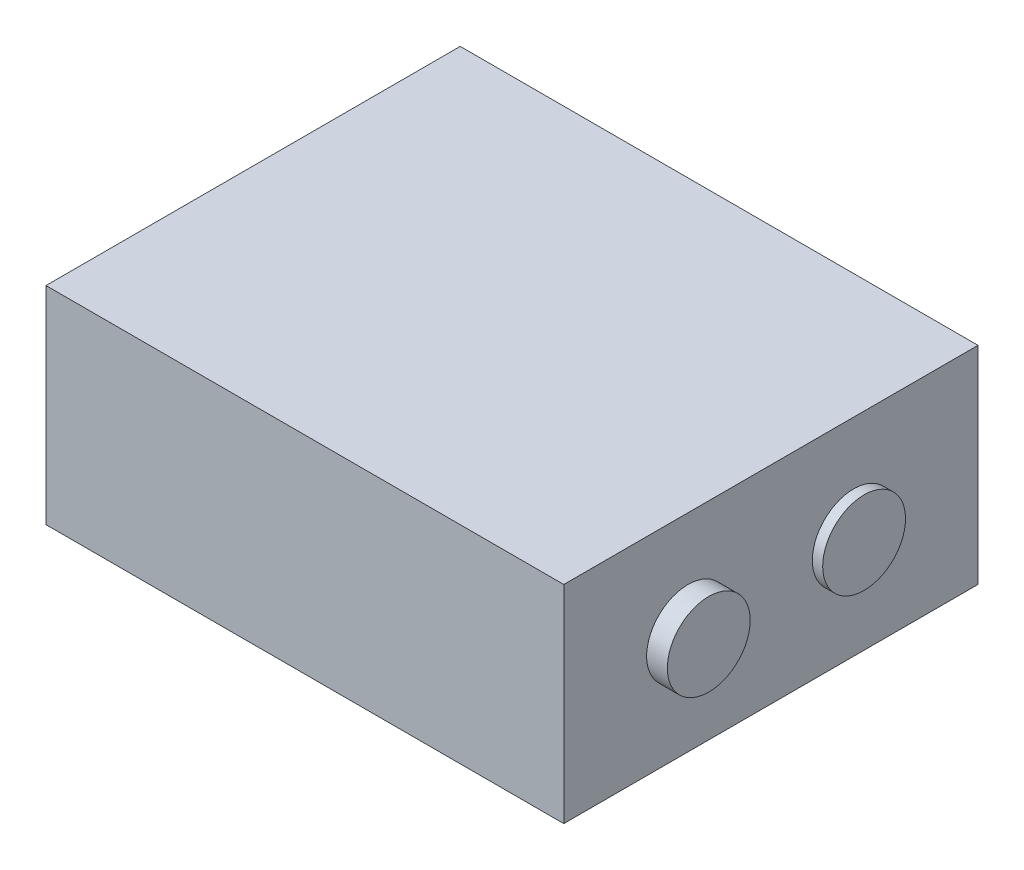
ISO-10303-21;
HEADER;
FILE_DESCRIPTION(('STEP AP214'),'2;1');
FILE_NAME('part.step','',(''),(''),'','','');
FILE_SCHEMA(('AUTOMOTIVE_DESIGN { 1 0 10303 214 1 1 1 1 }'));
ENDSEC;
DATA;
#1=APPLICATION_CONTEXT('core data for automotive mechanical design processes');
#2=APPLICATION_PROTOCOL_DEFINITION('international standard','automotive_design',2000,#1);
#3=PRODUCT_CONTEXT('',#1,'mechanical');
#4=PRODUCT('Part','Part','',(#3));
#5=PRODUCT_RELATED_PRODUCT_CATEGORY('part','',(#4));
#6=PRODUCT_DEFINITION_FORMATION('','',#4);
#7=PRODUCT_DEFINITION_CONTEXT('part definition',#1,'design');
#8=PRODUCT_DEFINITION('design','',#6,#7);
#9=PRODUCT_DEFINITION_SHAPE('','',#8);
#10=(LENGTH_UNIT() NAMED_UNIT(*) SI_UNIT(.MILLI.,.METRE.));
#11=(NAMED_UNIT(*) PLANE_ANGLE_UNIT() SI_UNIT($,.RADIAN.));
#12=(NAMED_UNIT(*) SI_UNIT($,.STERADIAN.) SOLID_ANGLE_UNIT());
#13=UNCERTAINTY_MEASURE_WITH_UNIT(LENGTH_MEASURE(1.E-05),#10,'distance_accuracy_value','');
#14=(GEOMETRIC_REPRESENTATION_CONTEXT(3) GLOBAL_UNCERTAINTY_ASSIGNED_CONTEXT((#13)) GLOBAL_UNIT_ASSIGNED_CONTEXT((#10,
#11,#12)) REPRESENTATION_CONTEXT('',''));
#15=CARTESIAN_POINT('',(0.,0.,0.));
#16=DIRECTION('',(0.,0.,1.));
#17=DIRECTION('',(1.,0.,0.));
#18=AXIS2_PLACEMENT_3D('',#15,#16,#17);
#19=CARTESIAN_POINT('',(250.,200.,200.));
#20=DIRECTION('',(-1.,0.,0.));
#21=DIRECTION('',(0.,0.,1.));
#22=AXIS2_PLACEMENT_3D('',#19,#20,#21);
#23=PLANE('',#22);
#24=CARTESIAN_POINT('',(250.,100.,80.));
#25=DIRECTION('',(1.,0.,0.));
#26=DIRECTION('',(0.,0.,-1.));
#27=AXIS2_PLACEMENT_3D('',#24,#25,#26);
#28=CIRCLE('',#27,40.);
#29=CARTESIAN_POINT('',(250.,100.,40.));
#30=VERTEX_POINT('',#29);
#31=EDGE_CURVE('E293',#30,#30,#28,.F.);
#32=ORIENTED_EDGE('',*,*,#31,.T.);
#33=EDGE_LOOP('',(#32));
#34=FACE_BOUND('',#33,.T.);
#35=CARTESIAN_POINT('',(250.,100.,-80.));
#36=DIRECTION('',(-1.,0.,0.));
#37=DIRECTION('',(0.,0.,1.));
#38=AXIS2_PLACEMENT_3D('',#35,#36,#37);
#39=CIRCLE('',#38,40.);
#40=CARTESIAN_POINT('',(250.,100.,-40.));
#41=VERTEX_POINT('',#40);
#42=EDGE_CURVE('E50',#41,#41,#39,.F.);
#43=ORIENTED_EDGE('',*,*,#42,.F.);
#44=EDGE_LOOP('',(#43));
#45=FACE_BOUND('',#44,.T.);
#46=DIRECTION('',(0.,0.,-1.));
#47=VECTOR('',#46,1.);
#48=CARTESIAN_POINT('',(250.,0.,200.));
#49=LINE('',#48,#47);
#50=CARTESIAN_POINT('',(250.,0.,200.));
#51=VERTEX_POINT('',#50);
#52=CARTESIAN_POINT('',(250.,0.,-200.));
#53=VERTEX_POINT('',#52);
#54=EDGE_CURVE('E109',#51,#53,#49,.T.);
#55=ORIENTED_EDGE('',*,*,#54,.T.);
#56=DIRECTION('',(0.,-1.,0.));
#57=VECTOR('',#56,1.);
#58=CARTESIAN_POINT('',(250.,200.,-200.));
#59=LINE('',#58,#57);
#60=CARTESIAN_POINT('',(250.,200.,-200.));
#61=VERTEX_POINT('',#60);
#62=EDGE_CURVE('E100',#61,#53,#59,.T.);
#63=ORIENTED_EDGE('',*,*,#62,.F.);
#64=DIRECTION('',(0.,0.,-1.));
#65=VECTOR('',#64,1.);
#66=CARTESIAN_POINT('',(250.,200.,200.));
#67=LINE('',#66,#65);
#68=CARTESIAN_POINT('',(250.,200.,200.));
#69=VERTEX_POINT('',#68);
#70=EDGE_CURVE('E94',#69,#61,#67,.T.);
#71=ORIENTED_EDGE('',*,*,#70,.F.);
#72=DIRECTION('',(0.,-1.,0.));
#73=VECTOR('',#72,1.);
#74=CARTESIAN_POINT('',(250.,200.,200.));
#75=LINE('',#74,#73);
#76=EDGE_CURVE('E105',#69,#51,#75,.T.);
#77=ORIENTED_EDGE('',*,*,#76,.T.);
#78=EDGE_LOOP('',(#55,#63,#71,#77));
#79=FACE_BOUND('',#78,.T.);
#80=ADVANCED_FACE('F42',(#34,#45,#79),#23,.F.);
#81=CARTESIAN_POINT('',(-250.,200.,-200.));
#82=DIRECTION('',(0.,0.,1.));
#83=DIRECTION('',(1.,0.,0.));
#84=AXIS2_PLACEMENT_3D('',#81,#82,#83);
#85=PLANE('',#84);
#86=DIRECTION('',(-1.,0.,0.));
#87=VECTOR('',#86,1.);
#88=CARTESIAN_POINT('',(-250.,0.,-200.));
#89=LINE('',#88,#87);
#90=CARTESIAN_POINT('',(-250.,0.,-200.));
#91=VERTEX_POINT('',#90);
#92=EDGE_CURVE('E99',#53,#91,#89,.T.);
#93=ORIENTED_EDGE('',*,*,#92,.T.);
#94=DIRECTION('',(0.,-1.,0.));
#95=VECTOR('',#94,1.);
#96=CARTESIAN_POINT('',(-250.,200.,-200.));
#97=LINE('',#96,#95);
#98=CARTESIAN_POINT('',(-250.,200.,-200.));
#99=VERTEX_POINT('',#98);
#100=EDGE_CURVE('E97',#99,#91,#97,.T.);
#101=ORIENTED_EDGE('',*,*,#100,.F.);
#102=DIRECTION('',(-1.,0.,0.));
#103=VECTOR('',#102,1.);
#104=CARTESIAN_POINT('',(-250.,200.,-200.));
#105=LINE('',#104,#103);
#106=EDGE_CURVE('E89',#61,#99,#105,.T.);
#107=ORIENTED_EDGE('',*,*,#106,.F.);
#108=ORIENTED_EDGE('',*,*,#62,.T.);
#109=EDGE_LOOP('',(#93,#101,#107,#108));
#110=FACE_BOUND('',#109,.T.);
#111=ADVANCED_FACE('F98',(#110),#85,.F.);
#112=CARTESIAN_POINT('',(-250.,200.,200.));
#113=DIRECTION('',(1.,0.,0.));
#114=DIRECTION('',(0.,0.,-1.));
#115=AXIS2_PLACEMENT_3D('',#112,#113,#114);
#116=PLANE('',#115);
#117=CARTESIAN_POINT('',(-250.,100.,80.));
#118=DIRECTION('',(1.,0.,0.));
#119=DIRECTION('',(0.,0.,-1.));
#120=AXIS2_PLACEMENT_3D('',#117,#118,#119);
#121=CIRCLE('',#120,40.);
#122=CARTESIAN_POINT('',(-250.,100.,40.));
#123=VERTEX_POINT('',#122);
#124=EDGE_CURVE('E11',#123,#123,#121,.F.);
#125=ORIENTED_EDGE('',*,*,#124,.F.);
#126=EDGE_LOOP('',(#125));
#127=FACE_BOUND('',#126,.T.);
#128=CARTESIAN_POINT('',(-250.,100.,-80.));
#129=DIRECTION('',(1.,0.,0.));
#130=DIRECTION('',(0.,0.,-1.));
#131=AXIS2_PLACEMENT_3D('',#128,#129,#130);
#132=CIRCLE('',#131,40.);
#133=CARTESIAN_POINT('',(-250.,100.,-120.));
#134=VERTEX_POINT('',#133);
#135=EDGE_CURVE('E286',#134,#134,#132,.T.);
#136=ORIENTED_EDGE('',*,*,#135,.T.);
#137=EDGE_LOOP('',(#136));
#138=FACE_BOUND('',#137,.T.);
#139=DIRECTION('',(0.,0.,1.));
#140=VECTOR('',#139,1.);
#141=CARTESIAN_POINT('',(-250.,0.,200.));
#142=LINE('',#141,#140);
#143=CARTESIAN_POINT('',(-250.,0.,200.));
#144=VERTEX_POINT('',#143);
#145=EDGE_CURVE('E75',#91,#144,#142,.T.);
#146=ORIENTED_EDGE('',*,*,#145,.T.);
#147=DIRECTION('',(0.,-1.,0.));
#148=VECTOR('',#147,1.);
#149=CARTESIAN_POINT('',(-250.,200.,200.));
#150=LINE('',#149,#148);
#151=CARTESIAN_POINT('',(-250.,200.,200.));
#152=VERTEX_POINT('',#151);
#153=EDGE_CURVE('E101',#152,#144,#150,.T.);
#154=ORIENTED_EDGE('',*,*,#153,.F.);
#155=DIRECTION('',(0.,0.,1.));
#156=VECTOR('',#155,1.);
#157=CARTESIAN_POINT('',(-250.,200.,200.));
#158=LINE('',#157,#156);
#159=EDGE_CURVE('E92',#99,#152,#158,.T.);
#160=ORIENTED_EDGE('',*,*,#159,.F.);
#161=ORIENTED_EDGE('',*,*,#100,.T.);
#162=EDGE_LOOP('',(#146,#154,#160,#161));
#163=FACE_BOUND('',#162,.T.);
#164=ADVANCED_FACE('F103',(#127,#138,#163),#116,.F.);
#165=CARTESIAN_POINT('',(-250.,200.,200.));
#166=DIRECTION('',(0.,0.,-1.));
#167=DIRECTION('',(-1.,0.,0.));
#168=AXIS2_PLACEMENT_3D('',#165,#166,#167);
#169=PLANE('',#168);
#170=DIRECTION('',(1.,0.,0.));
#171=VECTOR('',#170,1.);
#172=CARTESIAN_POINT('',(-250.,0.,200.));
#173=LINE('',#172,#171);
#174=EDGE_CURVE('E81',#144,#51,#173,.T.);
#175=ORIENTED_EDGE('',*,*,#174,.T.);
#176=ORIENTED_EDGE('',*,*,#76,.F.);
#177=DIRECTION('',(1.,0.,0.));
#178=VECTOR('',#177,1.);
#179=CARTESIAN_POINT('',(-250.,200.,200.));
#180=LINE('',#179,#178);
#181=EDGE_CURVE('E58',#152,#69,#180,.T.);
#182=ORIENTED_EDGE('',*,*,#181,.F.);
#183=ORIENTED_EDGE('',*,*,#153,.T.);
#184=EDGE_LOOP('',(#175,#176,#182,#183));
#185=FACE_BOUND('',#184,.T.);
#186=ADVANCED_FACE('F138',(#185),#169,.F.);
#187=CARTESIAN_POINT('',(0.,200.,0.));
#188=DIRECTION('',(0.,-1.,0.));
#189=DIRECTION('',(0.,0.,-1.));
#190=AXIS2_PLACEMENT_3D('',#187,#188,#189);
#191=PLANE('',#190);
#192=ORIENTED_EDGE('',*,*,#70,.T.);
#193=ORIENTED_EDGE('',*,*,#106,.T.);
#194=ORIENTED_EDGE('',*,*,#159,.T.);
#195=ORIENTED_EDGE('',*,*,#181,.T.);
#196=EDGE_LOOP('',(#192,#193,#194,#195));
#197=FACE_BOUND('',#196,.T.);
#198=ADVANCED_FACE('F90',(#197),#191,.F.);
#199=CARTESIAN_POINT('',(0.,0.,0.));
#200=DIRECTION('',(0.,-1.,0.));
#201=DIRECTION('',(0.,0.,-1.));
#202=AXIS2_PLACEMENT_3D('',#199,#200,#201);
#203=PLANE('',#202);
#204=ORIENTED_EDGE('',*,*,#54,.F.);
#205=ORIENTED_EDGE('',*,*,#174,.F.);
#206=ORIENTED_EDGE('',*,*,#145,.F.);
#207=ORIENTED_EDGE('',*,*,#92,.F.);
#208=EDGE_LOOP('',(#204,#205,#206,#207));
#209=FACE_BOUND('',#208,.T.);
#210=ADVANCED_FACE('F128',(#209),#203,.T.);
#211=CARTESIAN_POINT('',(260.,100.,-80.));
#212=DIRECTION('',(-1.,0.,0.));
#213=DIRECTION('',(0.,0.,1.));
#214=AXIS2_PLACEMENT_3D('',#211,#212,#213);
#215=CYLINDRICAL_SURFACE('',#214,40.);
#216=CARTESIAN_POINT('',(260.,100.,-80.));
#217=DIRECTION('',(1.,0.,0.));
#218=DIRECTION('',(0.,0.,-1.));
#219=AXIS2_PLACEMENT_3D('',#216,#217,#218);
#220=CIRCLE('',#219,40.);
#221=CARTESIAN_POINT('',(260.,100.,-120.));
#222=VERTEX_POINT('',#221);
#223=EDGE_CURVE('E112',#222,#222,#220,.T.);
#224=ORIENTED_EDGE('',*,*,#223,.F.);
#225=EDGE_LOOP('',(#224));
#226=FACE_BOUND('',#225,.T.);
#227=ORIENTED_EDGE('',*,*,#42,.T.);
#228=EDGE_LOOP('',(#227));
#229=FACE_BOUND('',#228,.T.);
#230=ADVANCED_FACE('F121',(#226,#229),#215,.T.);
#231=CARTESIAN_POINT('',(260.,100.,-80.));
#232=DIRECTION('',(1.,0.,0.));
#233=DIRECTION('',(0.,0.,-1.));
#234=AXIS2_PLACEMENT_3D('',#231,#232,#233);
#235=PLANE('',#234);
#236=ORIENTED_EDGE('',*,*,#223,.T.);
#237=EDGE_LOOP('',(#236));
#238=FACE_BOUND('',#237,.T.);
#239=ADVANCED_FACE('F135',(#238),#235,.T.);
#240=CARTESIAN_POINT('',(270.,100.,80.));
#241=DIRECTION('',(-1.,0.,0.));
#242=DIRECTION('',(0.,0.,1.));
#243=AXIS2_PLACEMENT_3D('',#240,#241,#242);
#244=CYLINDRICAL_SURFACE('',#243,40.);
#245=CARTESIAN_POINT('',(270.,100.,80.));
#246=DIRECTION('',(1.,0.,0.));
#247=DIRECTION('',(0.,0.,-1.));
#248=AXIS2_PLACEMENT_3D('',#245,#246,#247);
#249=CIRCLE('',#248,40.);
#250=CARTESIAN_POINT('',(270.,100.,40.));
#251=VERTEX_POINT('',#250);
#252=EDGE_CURVE('E295',#251,#251,#249,.F.);
#253=ORIENTED_EDGE('',*,*,#252,.T.);
#254=EDGE_LOOP('',(#253));
#255=FACE_BOUND('',#254,.T.);
#256=ORIENTED_EDGE('',*,*,#31,.F.);
#257=EDGE_LOOP('',(#256));
#258=FACE_BOUND('',#257,.T.);
#259=ADVANCED_FACE('F185',(#255,#258),#244,.T.);
#260=CARTESIAN_POINT('',(270.,0.,0.));
#261=DIRECTION('',(1.,0.,0.));
#262=DIRECTION('',(0.,0.,-1.));
#263=AXIS2_PLACEMENT_3D('',#260,#261,#262);
#264=PLANE('',#263);
#265=ORIENTED_EDGE('',*,*,#252,.F.);
#266=EDGE_LOOP('',(#265));
#267=FACE_BOUND('',#266,.T.);
#268=ADVANCED_FACE('F201',(#267),#264,.T.);
#269=CARTESIAN_POINT('',(-260.,100.,-80.));
#270=DIRECTION('',(1.,0.,0.));
#271=DIRECTION('',(0.,0.,-1.));
#272=AXIS2_PLACEMENT_3D('',#269,#270,#271);
#273=CYLINDRICAL_SURFACE('',#272,40.);
#274=CARTESIAN_POINT('',(-260.,100.,-80.));
#275=DIRECTION('',(1.,0.,0.));
#276=DIRECTION('',(0.,0.,-1.));
#277=AXIS2_PLACEMENT_3D('',#274,#275,#276);
#278=CIRCLE('',#277,40.);
#279=CARTESIAN_POINT('',(-260.,100.,-120.));
#280=VERTEX_POINT('',#279);
#281=EDGE_CURVE('E289',#280,#280,#278,.T.);
#282=ORIENTED_EDGE('',*,*,#281,.T.);
#283=EDGE_LOOP('',(#282));
#284=FACE_BOUND('',#283,.T.);
#285=ORIENTED_EDGE('',*,*,#135,.F.);
#286=EDGE_LOOP('',(#285));
#287=FACE_BOUND('',#286,.T.);
#288=ADVANCED_FACE('F211',(#284,#287),#273,.T.);
#289=CARTESIAN_POINT('',(-260.,100.,-80.));
#290=DIRECTION('',(-1.,0.,0.));
#291=DIRECTION('',(0.,0.,-1.));
#292=AXIS2_PLACEMENT_3D('',#289,#290,#291);
#293=PLANE('',#292);
#294=ORIENTED_EDGE('',*,*,#281,.F.);
#295=EDGE_LOOP('',(#294));
#296=FACE_BOUND('',#295,.T.);
#297=ADVANCED_FACE('F222',(#296),#293,.T.);
#298=CARTESIAN_POINT('',(-270.,100.,80.));
#299=DIRECTION('',(1.,0.,0.));
#300=DIRECTION('',(0.,0.,-1.));
#301=AXIS2_PLACEMENT_3D('',#298,#299,#300);
#302=CYLINDRICAL_SURFACE('',#301,40.);
#303=CARTESIAN_POINT('',(-270.,100.,80.));
#304=DIRECTION('',(1.,0.,0.));
#305=DIRECTION('',(0.,0.,-1.));
#306=AXIS2_PLACEMENT_3D('',#303,#304,#305);
#307=CIRCLE('',#306,40.);
#308=CARTESIAN_POINT('',(-270.,100.,40.));
#309=VERTEX_POINT('',#308);
#310=EDGE_CURVE('E285',#309,#309,#307,.F.);
#311=ORIENTED_EDGE('',*,*,#310,.F.);
#312=EDGE_LOOP('',(#311));
#313=FACE_BOUND('',#312,.T.);
#314=ORIENTED_EDGE('',*,*,#124,.T.);
#315=EDGE_LOOP('',(#314));
#316=FACE_BOUND('',#315,.T.);
#317=ADVANCED_FACE('F229',(#313,#316),#302,.T.);
#318=CARTESIAN_POINT('',(-270.,0.,0.));
#319=DIRECTION('',(-1.,0.,0.));
#320=DIRECTION('',(0.,0.,-1.));
#321=AXIS2_PLACEMENT_3D('',#318,#319,#320);
#322=PLANE('',#321);
#323=ORIENTED_EDGE('',*,*,#310,.T.);
#324=EDGE_LOOP('',(#323));
#325=FACE_BOUND('',#324,.T.);
#326=ADVANCED_FACE('F237',(#325),#322,.T.);
#327=CLOSED_SHELL('',(#80,#111,#164,#186,#198,#210,#230,#239,#259,#268,#288,#297,#317,#326));
#328=MANIFOLD_SOLID_BREP('B2',#327);
#329=ADVANCED_BREP_SHAPE_REPRESENTATION('',(#18,#328),#14);
#330=SHAPE_DEFINITION_REPRESENTATION(#9,#329);
ENDSEC;
END-ISO-10303-21;
